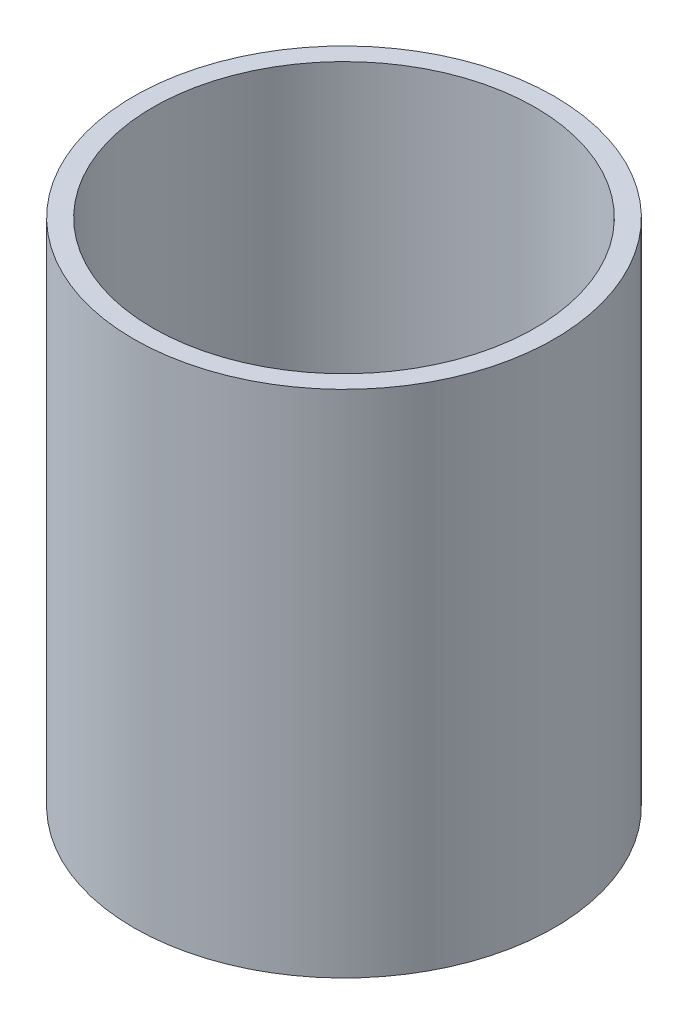
ISO-10303-21;
HEADER;
FILE_DESCRIPTION(('STEP AP214'),'2;1');
FILE_NAME('part.step','',(''),(''),'','','');
FILE_SCHEMA(('AUTOMOTIVE_DESIGN { 1 0 10303 214 1 1 1 1 }'));
ENDSEC;
DATA;
#1=APPLICATION_CONTEXT('core data for automotive mechanical design processes');
#2=APPLICATION_PROTOCOL_DEFINITION('international standard','automotive_design',2000,#1);
#3=PRODUCT_CONTEXT('',#1,'mechanical');
#4=PRODUCT('Part','Part','',(#3));
#5=PRODUCT_RELATED_PRODUCT_CATEGORY('part','',(#4));
#6=PRODUCT_DEFINITION_FORMATION('','',#4);
#7=PRODUCT_DEFINITION_CONTEXT('part definition',#1,'design');
#8=PRODUCT_DEFINITION('design','',#6,#7);
#9=PRODUCT_DEFINITION_SHAPE('','',#8);
#10=(LENGTH_UNIT() NAMED_UNIT(*) SI_UNIT(.MILLI.,.METRE.));
#11=(NAMED_UNIT(*) PLANE_ANGLE_UNIT() SI_UNIT($,.RADIAN.));
#12=(NAMED_UNIT(*) SI_UNIT($,.STERADIAN.) SOLID_ANGLE_UNIT());
#13=UNCERTAINTY_MEASURE_WITH_UNIT(LENGTH_MEASURE(1.E-05),#10,'distance_accuracy_value','');
#14=(GEOMETRIC_REPRESENTATION_CONTEXT(3) GLOBAL_UNCERTAINTY_ASSIGNED_CONTEXT((#13)) GLOBAL_UNIT_ASSIGNED_CONTEXT((#10,
#11,#12)) REPRESENTATION_CONTEXT('',''));
#15=CARTESIAN_POINT('',(0.,0.,0.));
#16=DIRECTION('',(0.,0.,1.));
#17=DIRECTION('',(1.,0.,0.));
#18=AXIS2_PLACEMENT_3D('',#15,#16,#17);
#19=CARTESIAN_POINT('',(0.,80.,0.));
#20=DIRECTION('',(0.,1.,0.));
#21=DIRECTION('',(0.,0.,1.));
#22=AXIS2_PLACEMENT_3D('',#19,#20,#21);
#23=PLANE('',#22);
#24=CARTESIAN_POINT('',(0.,80.,0.));
#25=DIRECTION('',(0.,1.,0.));
#26=DIRECTION('',(0.,0.,1.));
#27=AXIS2_PLACEMENT_3D('',#24,#25,#26);
#28=CIRCLE('',#27,33.);
#29=CARTESIAN_POINT('',(0.,80.,33.));
#30=VERTEX_POINT('',#29);
#31=EDGE_CURVE('E10',#30,#30,#28,.T.);
#32=ORIENTED_EDGE('',*,*,#31,.T.);
#33=EDGE_LOOP('',(#32));
#34=FACE_BOUND('',#33,.T.);
#35=CARTESIAN_POINT('',(0.,80.,0.));
#36=DIRECTION('',(0.,1.,0.));
#37=DIRECTION('',(0.,0.,1.));
#38=AXIS2_PLACEMENT_3D('',#35,#36,#37);
#39=CIRCLE('',#38,30.);
#40=CARTESIAN_POINT('',(0.,80.,30.));
#41=VERTEX_POINT('',#40);
#42=EDGE_CURVE('E30',#41,#41,#39,.T.);
#43=ORIENTED_EDGE('',*,*,#42,.F.);
#44=EDGE_LOOP('',(#43));
#45=FACE_BOUND('',#44,.T.);
#46=ADVANCED_FACE('F15',(#34,#45),#23,.T.);
#47=CARTESIAN_POINT('',(0.,0.,0.));
#48=DIRECTION('',(0.,1.,0.));
#49=DIRECTION('',(0.,0.,1.));
#50=AXIS2_PLACEMENT_3D('',#47,#48,#49);
#51=PLANE('',#50);
#52=CARTESIAN_POINT('',(0.,0.,0.));
#53=DIRECTION('',(0.,1.,0.));
#54=DIRECTION('',(0.,0.,1.));
#55=AXIS2_PLACEMENT_3D('',#52,#53,#54);
#56=CIRCLE('',#55,33.);
#57=CARTESIAN_POINT('',(0.,0.,33.));
#58=VERTEX_POINT('',#57);
#59=EDGE_CURVE('E19',#58,#58,#56,.T.);
#60=ORIENTED_EDGE('',*,*,#59,.F.);
#61=EDGE_LOOP('',(#60));
#62=FACE_BOUND('',#61,.T.);
#63=CARTESIAN_POINT('',(0.,0.,0.));
#64=DIRECTION('',(0.,1.,0.));
#65=DIRECTION('',(0.,0.,1.));
#66=AXIS2_PLACEMENT_3D('',#63,#64,#65);
#67=CIRCLE('',#66,30.);
#68=CARTESIAN_POINT('',(0.,0.,30.));
#69=VERTEX_POINT('',#68);
#70=EDGE_CURVE('E32',#69,#69,#67,.T.);
#71=ORIENTED_EDGE('',*,*,#70,.T.);
#72=EDGE_LOOP('',(#71));
#73=FACE_BOUND('',#72,.T.);
#74=ADVANCED_FACE('F45',(#62,#73),#51,.F.);
#75=CARTESIAN_POINT('',(0.,80.,0.));
#76=DIRECTION('',(0.,-1.,0.));
#77=DIRECTION('',(0.,0.,-1.));
#78=AXIS2_PLACEMENT_3D('',#75,#76,#77);
#79=CYLINDRICAL_SURFACE('',#78,33.);
#80=ORIENTED_EDGE('',*,*,#31,.F.);
#81=EDGE_LOOP('',(#80));
#82=FACE_BOUND('',#81,.T.);
#83=ORIENTED_EDGE('',*,*,#59,.T.);
#84=EDGE_LOOP('',(#83));
#85=FACE_BOUND('',#84,.T.);
#86=ADVANCED_FACE('F17',(#82,#85),#79,.T.);
#87=CARTESIAN_POINT('',(0.,80.,0.));
#88=DIRECTION('',(0.,-1.,0.));
#89=DIRECTION('',(0.,0.,-1.));
#90=AXIS2_PLACEMENT_3D('',#87,#88,#89);
#91=CYLINDRICAL_SURFACE('',#90,30.);
#92=ORIENTED_EDGE('',*,*,#42,.T.);
#93=EDGE_LOOP('',(#92));
#94=FACE_BOUND('',#93,.T.);
#95=ORIENTED_EDGE('',*,*,#70,.F.);
#96=EDGE_LOOP('',(#95));
#97=FACE_BOUND('',#96,.T.);
#98=ADVANCED_FACE('F41',(#94,#97),#91,.F.);
#99=CLOSED_SHELL('',(#46,#74,#86,#98));
#100=MANIFOLD_SOLID_BREP('B1',#99);
#101=ADVANCED_BREP_SHAPE_REPRESENTATION('',(#18,#100),#14);
#102=SHAPE_DEFINITION_REPRESENTATION(#9,#101);
ENDSEC;
END-ISO-10303-21;
